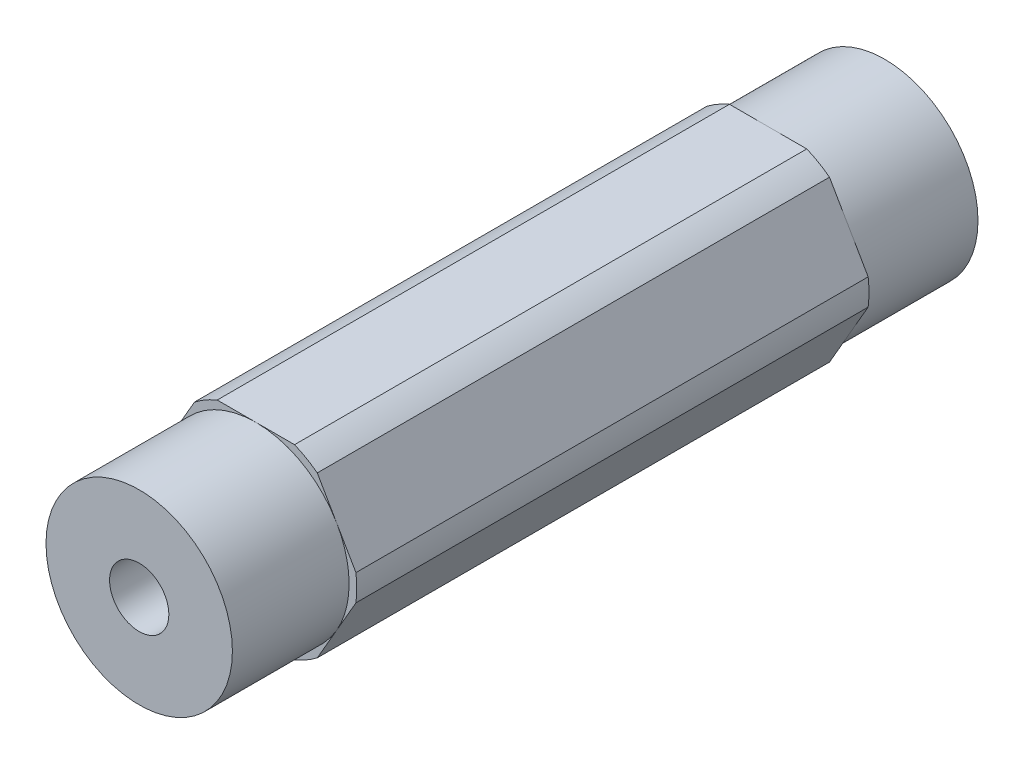
ISO-10303-21;
HEADER;
FILE_DESCRIPTION(('STEP AP214'),'2;1');
FILE_NAME('part.step','',(''),(''),'','','');
FILE_SCHEMA(('AUTOMOTIVE_DESIGN { 1 0 10303 214 1 1 1 1 }'));
ENDSEC;
DATA;
#1=APPLICATION_CONTEXT('core data for automotive mechanical design processes');
#2=APPLICATION_PROTOCOL_DEFINITION('international standard','automotive_design',2000,#1);
#3=PRODUCT_CONTEXT('',#1,'mechanical');
#4=PRODUCT('Part','Part','',(#3));
#5=PRODUCT_RELATED_PRODUCT_CATEGORY('part','',(#4));
#6=PRODUCT_DEFINITION_FORMATION('','',#4);
#7=PRODUCT_DEFINITION_CONTEXT('part definition',#1,'design');
#8=PRODUCT_DEFINITION('design','',#6,#7);
#9=PRODUCT_DEFINITION_SHAPE('','',#8);
#10=(LENGTH_UNIT() NAMED_UNIT(*) SI_UNIT(.MILLI.,.METRE.));
#11=(NAMED_UNIT(*) PLANE_ANGLE_UNIT() SI_UNIT($,.RADIAN.));
#12=(NAMED_UNIT(*) SI_UNIT($,.STERADIAN.) SOLID_ANGLE_UNIT());
#13=UNCERTAINTY_MEASURE_WITH_UNIT(LENGTH_MEASURE(1.E-05),#10,'distance_accuracy_value','');
#14=(GEOMETRIC_REPRESENTATION_CONTEXT(3) GLOBAL_UNCERTAINTY_ASSIGNED_CONTEXT((#13)) GLOBAL_UNIT_ASSIGNED_CONTEXT((#10,
#11,#12)) REPRESENTATION_CONTEXT('',''));
#15=CARTESIAN_POINT('',(0.,0.,0.));
#16=DIRECTION('',(0.,0.,1.));
#17=DIRECTION('',(1.,0.,0.));
#18=AXIS2_PLACEMENT_3D('',#15,#16,#17);
#19=CARTESIAN_POINT('',(3.66617420935409,6.34999999999998,25.4));
#20=DIRECTION('',(0.,-1.,0.));
#21=DIRECTION('',(1.,0.,0.));
#22=AXIS2_PLACEMENT_3D('',#19,#20,#21);
#23=PLANE('',#22);
#24=DIRECTION('',(1.,0.,0.));
#25=VECTOR('',#24,1.);
#26=CARTESIAN_POINT('',(3.66617420935409,6.34999999999998,-17.4498));
#27=LINE('',#26,#25);
#28=CARTESIAN_POINT('',(-2.63498102459971,6.34999999999996,-17.4498));
#29=VERTEX_POINT('',#28);
#30=CARTESIAN_POINT('',(0.,6.34999999999997,-17.4498));
#31=VERTEX_POINT('',#30);
#32=EDGE_CURVE('E216',#29,#31,#27,.T.);
#33=ORIENTED_EDGE('',*,*,#32,.F.);
#34=DIRECTION('',(0.,0.,1.));
#35=VECTOR('',#34,1.);
#36=CARTESIAN_POINT('',(-2.63498102459971,6.34999999999996,-25.4));
#37=LINE('',#36,#35);
#38=CARTESIAN_POINT('',(-2.63498102459971,6.34999999999996,17.4498));
#39=VERTEX_POINT('',#38);
#40=EDGE_CURVE('E294',#39,#29,#37,.F.);
#41=ORIENTED_EDGE('',*,*,#40,.F.);
#42=DIRECTION('',(-1.,0.,0.));
#43=VECTOR('',#42,1.);
#44=CARTESIAN_POINT('',(3.66617420935409,6.34999999999998,17.4498));
#45=LINE('',#44,#43);
#46=CARTESIAN_POINT('',(0.,6.34999999999997,17.4498));
#47=VERTEX_POINT('',#46);
#48=EDGE_CURVE('E332',#47,#39,#45,.T.);
#49=ORIENTED_EDGE('',*,*,#48,.F.);
#50=CARTESIAN_POINT('',(2.63498102459967,6.34999999999997,17.4498));
#51=VERTEX_POINT('',#50);
#52=EDGE_CURVE('E336',#51,#47,#45,.T.);
#53=ORIENTED_EDGE('',*,*,#52,.F.);
#54=DIRECTION('',(0.,0.,1.));
#55=VECTOR('',#54,1.);
#56=CARTESIAN_POINT('',(2.63498102459967,6.34999999999997,-25.4));
#57=LINE('',#56,#55);
#58=CARTESIAN_POINT('',(2.63498102459967,6.34999999999997,-17.4498));
#59=VERTEX_POINT('',#58);
#60=EDGE_CURVE('E69',#59,#51,#57,.T.);
#61=ORIENTED_EDGE('',*,*,#60,.F.);
#62=EDGE_CURVE('E63',#31,#59,#27,.T.);
#63=ORIENTED_EDGE('',*,*,#62,.F.);
#64=EDGE_LOOP('',(#33,#41,#49,#53,#61,#63));
#65=FACE_BOUND('',#64,.T.);
#66=ADVANCED_FACE('F48',(#65),#23,.F.);
#67=CARTESIAN_POINT('',(-3.66617420935414,6.34999999999995,25.4));
#68=DIRECTION('',(0.866025403784442,-0.499999999999995,0.));
#69=DIRECTION('',(0.499999999999995,0.866025403784442,0.));
#70=AXIS2_PLACEMENT_3D('',#67,#68,#69);
#71=PLANE('',#70);
#72=DIRECTION('',(0.499999999999995,0.866025403784442,0.));
#73=VECTOR('',#72,1.);
#74=CARTESIAN_POINT('',(-3.66617420935414,6.34999999999995,-17.4498));
#75=LINE('',#74,#73);
#76=CARTESIAN_POINT('',(-6.81675182633101,0.893039494206661,-17.4498));
#77=VERTEX_POINT('',#76);
#78=CARTESIAN_POINT('',(-5.49926131403117,3.17499999999995,-17.4498));
#79=VERTEX_POINT('',#78);
#80=EDGE_CURVE('E213',#77,#79,#75,.T.);
#81=ORIENTED_EDGE('',*,*,#80,.F.);
#82=DIRECTION('',(0.,0.,1.));
#83=VECTOR('',#82,1.);
#84=CARTESIAN_POINT('',(-6.81675182633101,0.89303949420666,-25.4));
#85=LINE('',#84,#83);
#86=CARTESIAN_POINT('',(-6.81675182633101,0.89303949420666,17.4498));
#87=VERTEX_POINT('',#86);
#88=EDGE_CURVE('E283',#87,#77,#85,.F.);
#89=ORIENTED_EDGE('',*,*,#88,.F.);
#90=DIRECTION('',(-0.499999999999995,-0.866025403784442,0.));
#91=VECTOR('',#90,1.);
#92=CARTESIAN_POINT('',(-3.66617420935414,6.34999999999995,17.4498));
#93=LINE('',#92,#91);
#94=CARTESIAN_POINT('',(-5.49926131403117,3.17499999999995,17.4498));
#95=VERTEX_POINT('',#94);
#96=EDGE_CURVE('E327',#95,#87,#93,.T.);
#97=ORIENTED_EDGE('',*,*,#96,.F.);
#98=CARTESIAN_POINT('',(-4.18177080173134,5.45696050579324,17.4498));
#99=VERTEX_POINT('',#98);
#100=EDGE_CURVE('E331',#99,#95,#93,.T.);
#101=ORIENTED_EDGE('',*,*,#100,.F.);
#102=DIRECTION('',(0.,0.,1.));
#103=VECTOR('',#102,1.);
#104=CARTESIAN_POINT('',(-4.18177080173134,5.45696050579324,-25.4));
#105=LINE('',#104,#103);
#106=CARTESIAN_POINT('',(-4.18177080173134,5.45696050579324,-17.4498));
#107=VERTEX_POINT('',#106);
#108=EDGE_CURVE('E291',#107,#99,#105,.T.);
#109=ORIENTED_EDGE('',*,*,#108,.F.);
#110=EDGE_CURVE('E209',#79,#107,#75,.T.);
#111=ORIENTED_EDGE('',*,*,#110,.F.);
#112=EDGE_LOOP('',(#81,#89,#97,#101,#109,#111));
#113=FACE_BOUND('',#112,.T.);
#114=ADVANCED_FACE('F405',(#113),#71,.F.);
#115=CARTESIAN_POINT('',(-7.33234841870821,0.,25.4));
#116=DIRECTION('',(0.866025403784435,0.500000000000007,0.));
#117=DIRECTION('',(-0.500000000000007,0.866025403784435,0.));
#118=AXIS2_PLACEMENT_3D('',#115,#116,#117);
#119=PLANE('',#118);
#120=DIRECTION('',(-0.500000000000007,0.866025403784435,0.));
#121=VECTOR('',#120,1.);
#122=CARTESIAN_POINT('',(-7.33234841870821,0.,-17.4498));
#123=LINE('',#122,#121);
#124=CARTESIAN_POINT('',(-4.18177080173127,-5.4569605057933,-17.4498));
#125=VERTEX_POINT('',#124);
#126=CARTESIAN_POINT('',(-5.49926131403113,-3.17500000000003,-17.4498));
#127=VERTEX_POINT('',#126);
#128=EDGE_CURVE('E235',#125,#127,#123,.T.);
#129=ORIENTED_EDGE('',*,*,#128,.F.);
#130=DIRECTION('',(0.,0.,1.));
#131=VECTOR('',#130,1.);
#132=CARTESIAN_POINT('',(-4.18177080173127,-5.4569605057933,-25.4));
#133=LINE('',#132,#131);
#134=CARTESIAN_POINT('',(-4.18177080173127,-5.4569605057933,17.4498));
#135=VERTEX_POINT('',#134);
#136=EDGE_CURVE('E272',#135,#125,#133,.F.);
#137=ORIENTED_EDGE('',*,*,#136,.F.);
#138=DIRECTION('',(0.500000000000007,-0.866025403784435,0.));
#139=VECTOR('',#138,1.);
#140=CARTESIAN_POINT('',(-7.33234841870821,0.,17.4498));
#141=LINE('',#140,#139);
#142=CARTESIAN_POINT('',(-5.49926131403113,-3.17500000000003,17.4498));
#143=VERTEX_POINT('',#142);
#144=EDGE_CURVE('E322',#143,#135,#141,.T.);
#145=ORIENTED_EDGE('',*,*,#144,.F.);
#146=CARTESIAN_POINT('',(-6.81675182633099,-0.893039494206758,17.4498));
#147=VERTEX_POINT('',#146);
#148=EDGE_CURVE('E326',#147,#143,#141,.T.);
#149=ORIENTED_EDGE('',*,*,#148,.F.);
#150=DIRECTION('',(0.,0.,1.));
#151=VECTOR('',#150,1.);
#152=CARTESIAN_POINT('',(-6.81675182633099,-0.893039494206758,-25.4));
#153=LINE('',#152,#151);
#154=CARTESIAN_POINT('',(-6.81675182633099,-0.893039494206757,-17.4498));
#155=VERTEX_POINT('',#154);
#156=EDGE_CURVE('E280',#155,#147,#153,.T.);
#157=ORIENTED_EDGE('',*,*,#156,.F.);
#158=EDGE_CURVE('E231',#127,#155,#123,.T.);
#159=ORIENTED_EDGE('',*,*,#158,.F.);
#160=EDGE_LOOP('',(#129,#137,#145,#149,#157,#159));
#161=FACE_BOUND('',#160,.T.);
#162=ADVANCED_FACE('F457',(#161),#119,.F.);
#163=CARTESIAN_POINT('',(-3.66617420935405,-6.35,25.4));
#164=DIRECTION('',(0.,1.,0.));
#165=DIRECTION('',(-1.,0.,0.));
#166=AXIS2_PLACEMENT_3D('',#163,#164,#165);
#167=PLANE('',#166);
#168=DIRECTION('',(-1.,0.,0.));
#169=VECTOR('',#168,1.);
#170=CARTESIAN_POINT('',(-3.66617420935405,-6.35,-17.4498));
#171=LINE('',#170,#169);
#172=CARTESIAN_POINT('',(2.63498102459976,-6.34999999999994,-17.4498));
#173=VERTEX_POINT('',#172);
#174=CARTESIAN_POINT('',(0.,-6.34999999999997,-17.4498));
#175=VERTEX_POINT('',#174);
#176=EDGE_CURVE('E243',#173,#175,#171,.T.);
#177=ORIENTED_EDGE('',*,*,#176,.F.);
#178=DIRECTION('',(0.,0.,1.));
#179=VECTOR('',#178,1.);
#180=CARTESIAN_POINT('',(2.63498102459976,-6.34999999999994,-25.4));
#181=LINE('',#180,#179);
#182=CARTESIAN_POINT('',(2.63498102459976,-6.34999999999994,17.4498));
#183=VERTEX_POINT('',#182);
#184=EDGE_CURVE('E261',#183,#173,#181,.F.);
#185=ORIENTED_EDGE('',*,*,#184,.F.);
#186=DIRECTION('',(1.,0.,0.));
#187=VECTOR('',#186,1.);
#188=CARTESIAN_POINT('',(-3.66617420935405,-6.35,17.4498));
#189=LINE('',#188,#187);
#190=CARTESIAN_POINT('',(0.,-6.34999999999997,17.4498));
#191=VERTEX_POINT('',#190);
#192=EDGE_CURVE('E317',#191,#183,#189,.T.);
#193=ORIENTED_EDGE('',*,*,#192,.F.);
#194=CARTESIAN_POINT('',(-2.63498102459963,-6.34999999999999,17.4498));
#195=VERTEX_POINT('',#194);
#196=EDGE_CURVE('E321',#195,#191,#189,.T.);
#197=ORIENTED_EDGE('',*,*,#196,.F.);
#198=DIRECTION('',(0.,0.,1.));
#199=VECTOR('',#198,1.);
#200=CARTESIAN_POINT('',(-2.63498102459963,-6.34999999999999,-25.4));
#201=LINE('',#200,#199);
#202=CARTESIAN_POINT('',(-2.63498102459963,-6.34999999999999,-17.4498));
#203=VERTEX_POINT('',#202);
#204=EDGE_CURVE('E269',#203,#195,#201,.T.);
#205=ORIENTED_EDGE('',*,*,#204,.F.);
#206=EDGE_CURVE('E240',#175,#203,#171,.T.);
#207=ORIENTED_EDGE('',*,*,#206,.F.);
#208=EDGE_LOOP('',(#177,#185,#193,#197,#205,#207));
#209=FACE_BOUND('',#208,.T.);
#210=ADVANCED_FACE('F427',(#209),#167,.F.);
#211=CARTESIAN_POINT('',(3.66617420935418,-6.34999999999993,25.4));
#212=DIRECTION('',(-0.866025403784441,0.499999999999995,0.));
#213=DIRECTION('',(-0.499999999999995,-0.866025403784441,0.));
#214=AXIS2_PLACEMENT_3D('',#211,#212,#213);
#215=PLANE('',#214);
#216=DIRECTION('',(-0.499999999999995,-0.866025403784441,0.));
#217=VECTOR('',#216,1.);
#218=CARTESIAN_POINT('',(3.66617420935418,-6.34999999999993,-17.4498));
#219=LINE('',#218,#217);
#220=CARTESIAN_POINT('',(6.816751826331,-0.893039494206728,-17.4498));
#221=VERTEX_POINT('',#220);
#222=CARTESIAN_POINT('',(5.49926131403117,-3.17499999999995,-17.4498));
#223=VERTEX_POINT('',#222);
#224=EDGE_CURVE('E189',#221,#223,#219,.T.);
#225=ORIENTED_EDGE('',*,*,#224,.F.);
#226=DIRECTION('',(0.,0.,1.));
#227=VECTOR('',#226,1.);
#228=CARTESIAN_POINT('',(6.816751826331,-0.893039494206728,-25.4));
#229=LINE('',#228,#227);
#230=CARTESIAN_POINT('',(6.816751826331,-0.893039494206728,17.4498));
#231=VERTEX_POINT('',#230);
#232=EDGE_CURVE('E250',#231,#221,#229,.F.);
#233=ORIENTED_EDGE('',*,*,#232,.F.);
#234=DIRECTION('',(0.499999999999995,0.866025403784441,0.));
#235=VECTOR('',#234,1.);
#236=CARTESIAN_POINT('',(3.66617420935418,-6.34999999999993,17.4498));
#237=LINE('',#236,#235);
#238=CARTESIAN_POINT('',(5.49926131403117,-3.17499999999995,17.4498));
#239=VERTEX_POINT('',#238);
#240=EDGE_CURVE('E311',#239,#231,#237,.T.);
#241=ORIENTED_EDGE('',*,*,#240,.F.);
#242=CARTESIAN_POINT('',(4.18177080173139,-5.4569605057932,17.4498));
#243=VERTEX_POINT('',#242);
#244=EDGE_CURVE('E316',#243,#239,#237,.T.);
#245=ORIENTED_EDGE('',*,*,#244,.F.);
#246=DIRECTION('',(0.,0.,1.));
#247=VECTOR('',#246,1.);
#248=CARTESIAN_POINT('',(4.18177080173139,-5.4569605057932,-25.4));
#249=LINE('',#248,#247);
#250=CARTESIAN_POINT('',(4.18177080173139,-5.4569605057932,-17.4498));
#251=VERTEX_POINT('',#250);
#252=EDGE_CURVE('E258',#251,#243,#249,.T.);
#253=ORIENTED_EDGE('',*,*,#252,.F.);
#254=EDGE_CURVE('E232',#223,#251,#219,.T.);
#255=ORIENTED_EDGE('',*,*,#254,.F.);
#256=EDGE_LOOP('',(#225,#233,#241,#245,#253,#255));
#257=FACE_BOUND('',#256,.T.);
#258=ADVANCED_FACE('F434',(#257),#215,.F.);
#259=CARTESIAN_POINT('',(7.33234841870821,0.,25.4));
#260=DIRECTION('',(-0.866025403784438,-0.500000000000001,0.));
#261=DIRECTION('',(0.500000000000001,-0.866025403784438,0.));
#262=AXIS2_PLACEMENT_3D('',#259,#260,#261);
#263=PLANE('',#262);
#264=DIRECTION('',(0.500000000000001,-0.866025403784438,0.));
#265=VECTOR('',#264,1.);
#266=CARTESIAN_POINT('',(7.33234841870821,0.,-17.4498));
#267=LINE('',#266,#265);
#268=CARTESIAN_POINT('',(4.1817708017313,5.45696050579327,-17.4498));
#269=VERTEX_POINT('',#268);
#270=CARTESIAN_POINT('',(5.49926131403115,3.17499999999999,-17.4498));
#271=VERTEX_POINT('',#270);
#272=EDGE_CURVE('E171',#269,#271,#267,.T.);
#273=ORIENTED_EDGE('',*,*,#272,.F.);
#274=DIRECTION('',(0.,0.,1.));
#275=VECTOR('',#274,1.);
#276=CARTESIAN_POINT('',(4.1817708017313,5.45696050579327,-25.4));
#277=LINE('',#276,#275);
#278=CARTESIAN_POINT('',(4.18177080173131,5.45696050579327,17.4498));
#279=VERTEX_POINT('',#278);
#280=EDGE_CURVE('E301',#279,#269,#277,.F.);
#281=ORIENTED_EDGE('',*,*,#280,.F.);
#282=DIRECTION('',(-0.500000000000001,0.866025403784438,0.));
#283=VECTOR('',#282,1.);
#284=CARTESIAN_POINT('',(7.33234841870821,0.,17.4498));
#285=LINE('',#284,#283);
#286=CARTESIAN_POINT('',(5.49926131403115,3.17499999999999,17.4498));
#287=VERTEX_POINT('',#286);
#288=EDGE_CURVE('E341',#287,#279,#285,.T.);
#289=ORIENTED_EDGE('',*,*,#288,.F.);
#290=CARTESIAN_POINT('',(6.816751826331,0.893039494206714,17.4498));
#291=VERTEX_POINT('',#290);
#292=EDGE_CURVE('E344',#291,#287,#285,.T.);
#293=ORIENTED_EDGE('',*,*,#292,.F.);
#294=DIRECTION('',(0.,0.,1.));
#295=VECTOR('',#294,1.);
#296=CARTESIAN_POINT('',(6.816751826331,0.89303949420671,-25.4));
#297=LINE('',#296,#295);
#298=CARTESIAN_POINT('',(6.816751826331,0.89303949420671,-17.4498));
#299=VERTEX_POINT('',#298);
#300=EDGE_CURVE('E207',#299,#291,#297,.T.);
#301=ORIENTED_EDGE('',*,*,#300,.F.);
#302=EDGE_CURVE('E182',#271,#299,#267,.T.);
#303=ORIENTED_EDGE('',*,*,#302,.F.);
#304=EDGE_LOOP('',(#273,#281,#289,#293,#301,#303));
#305=FACE_BOUND('',#304,.T.);
#306=ADVANCED_FACE('F205',(#305),#263,.F.);
#307=CARTESIAN_POINT('',(0.,0.,-25.4));
#308=DIRECTION('',(0.,0.,1.));
#309=DIRECTION('',(1.,0.,0.));
#310=AXIS2_PLACEMENT_3D('',#307,#308,#309);
#311=CYLINDRICAL_SURFACE('',#310,6.875);
#312=ORIENTED_EDGE('',*,*,#232,.T.);
#313=CARTESIAN_POINT('',(0.,0.,-17.4498));
#314=DIRECTION('',(0.,0.,-1.));
#315=DIRECTION('',(-1.,0.,0.));
#316=AXIS2_PLACEMENT_3D('',#313,#314,#315);
#317=CIRCLE('',#316,6.875);
#318=EDGE_CURVE('E226',#221,#299,#317,.F.);
#319=ORIENTED_EDGE('',*,*,#318,.T.);
#320=ORIENTED_EDGE('',*,*,#300,.T.);
#321=CARTESIAN_POINT('',(0.,0.,17.4498));
#322=DIRECTION('',(0.,0.,1.));
#323=DIRECTION('',(1.,0.,0.));
#324=AXIS2_PLACEMENT_3D('',#321,#322,#323);
#325=CIRCLE('',#324,6.875);
#326=EDGE_CURVE('E56',#231,#291,#325,.T.);
#327=ORIENTED_EDGE('',*,*,#326,.F.);
#328=EDGE_LOOP('',(#312,#319,#320,#327));
#329=FACE_BOUND('',#328,.T.);
#330=ADVANCED_FACE('F438',(#329),#311,.T.);
#331=ORIENTED_EDGE('',*,*,#184,.T.);
#332=CARTESIAN_POINT('',(0.,0.,-17.4498));
#333=DIRECTION('',(0.,0.,-1.));
#334=DIRECTION('',(-1.,0.,0.));
#335=AXIS2_PLACEMENT_3D('',#332,#333,#334);
#336=CIRCLE('',#335,6.875);
#337=EDGE_CURVE('E244',#173,#251,#336,.F.);
#338=ORIENTED_EDGE('',*,*,#337,.T.);
#339=ORIENTED_EDGE('',*,*,#252,.T.);
#340=CARTESIAN_POINT('',(0.,0.,17.4498));
#341=DIRECTION('',(0.,0.,1.));
#342=DIRECTION('',(1.,0.,0.));
#343=AXIS2_PLACEMENT_3D('',#340,#341,#342);
#344=CIRCLE('',#343,6.875);
#345=EDGE_CURVE('E254',#183,#243,#344,.T.);
#346=ORIENTED_EDGE('',*,*,#345,.F.);
#347=EDGE_LOOP('',(#331,#338,#339,#346));
#348=FACE_BOUND('',#347,.T.);
#349=ADVANCED_FACE('F440',(#348),#311,.T.);
#350=ORIENTED_EDGE('',*,*,#136,.T.);
#351=CARTESIAN_POINT('',(0.,0.,-17.4498));
#352=DIRECTION('',(0.,0.,-1.));
#353=DIRECTION('',(-1.,0.,0.));
#354=AXIS2_PLACEMENT_3D('',#351,#352,#353);
#355=CIRCLE('',#354,6.875);
#356=EDGE_CURVE('E236',#125,#203,#355,.F.);
#357=ORIENTED_EDGE('',*,*,#356,.T.);
#358=ORIENTED_EDGE('',*,*,#204,.T.);
#359=CARTESIAN_POINT('',(0.,0.,17.4498));
#360=DIRECTION('',(0.,0.,1.));
#361=DIRECTION('',(1.,0.,0.));
#362=AXIS2_PLACEMENT_3D('',#359,#360,#361);
#363=CIRCLE('',#362,6.875);
#364=EDGE_CURVE('E265',#135,#195,#363,.T.);
#365=ORIENTED_EDGE('',*,*,#364,.F.);
#366=EDGE_LOOP('',(#350,#357,#358,#365));
#367=FACE_BOUND('',#366,.T.);
#368=ADVANCED_FACE('F446',(#367),#311,.T.);
#369=ORIENTED_EDGE('',*,*,#88,.T.);
#370=CARTESIAN_POINT('',(0.,0.,-17.4498));
#371=DIRECTION('',(0.,0.,-1.));
#372=DIRECTION('',(-1.,0.,0.));
#373=AXIS2_PLACEMENT_3D('',#370,#371,#372);
#374=CIRCLE('',#373,6.875);
#375=EDGE_CURVE('E222',#77,#155,#374,.F.);
#376=ORIENTED_EDGE('',*,*,#375,.T.);
#377=ORIENTED_EDGE('',*,*,#156,.T.);
#378=CARTESIAN_POINT('',(0.,0.,17.4498));
#379=DIRECTION('',(0.,0.,1.));
#380=DIRECTION('',(1.,0.,0.));
#381=AXIS2_PLACEMENT_3D('',#378,#379,#380);
#382=CIRCLE('',#381,6.875);
#383=EDGE_CURVE('E276',#87,#147,#382,.T.);
#384=ORIENTED_EDGE('',*,*,#383,.F.);
#385=EDGE_LOOP('',(#369,#376,#377,#384));
#386=FACE_BOUND('',#385,.T.);
#387=ADVANCED_FACE('F518',(#386),#311,.T.);
#388=ORIENTED_EDGE('',*,*,#40,.T.);
#389=CARTESIAN_POINT('',(0.,0.,-17.4498));
#390=DIRECTION('',(0.,0.,-1.));
#391=DIRECTION('',(-1.,0.,0.));
#392=AXIS2_PLACEMENT_3D('',#389,#390,#391);
#393=CIRCLE('',#392,6.875);
#394=EDGE_CURVE('E210',#29,#107,#393,.F.);
#395=ORIENTED_EDGE('',*,*,#394,.T.);
#396=ORIENTED_EDGE('',*,*,#108,.T.);
#397=CARTESIAN_POINT('',(0.,0.,17.4498));
#398=DIRECTION('',(0.,0.,1.));
#399=DIRECTION('',(1.,0.,0.));
#400=AXIS2_PLACEMENT_3D('',#397,#398,#399);
#401=CIRCLE('',#400,6.875);
#402=EDGE_CURVE('E287',#39,#99,#401,.T.);
#403=ORIENTED_EDGE('',*,*,#402,.F.);
#404=EDGE_LOOP('',(#388,#395,#396,#403));
#405=FACE_BOUND('',#404,.T.);
#406=ADVANCED_FACE('F409',(#405),#311,.T.);
#407=ORIENTED_EDGE('',*,*,#280,.T.);
#408=CARTESIAN_POINT('',(0.,0.,-17.4498));
#409=DIRECTION('',(0.,0.,-1.));
#410=DIRECTION('',(-1.,0.,0.));
#411=AXIS2_PLACEMENT_3D('',#408,#409,#410);
#412=CIRCLE('',#411,6.875);
#413=EDGE_CURVE('E12',#269,#59,#412,.F.);
#414=ORIENTED_EDGE('',*,*,#413,.T.);
#415=ORIENTED_EDGE('',*,*,#60,.T.);
#416=CARTESIAN_POINT('',(0.,0.,17.4498));
#417=DIRECTION('',(0.,0.,1.));
#418=DIRECTION('',(1.,0.,0.));
#419=AXIS2_PLACEMENT_3D('',#416,#417,#418);
#420=CIRCLE('',#419,6.875);
#421=EDGE_CURVE('E298',#279,#51,#420,.T.);
#422=ORIENTED_EDGE('',*,*,#421,.F.);
#423=EDGE_LOOP('',(#407,#414,#415,#422));
#424=FACE_BOUND('',#423,.T.);
#425=ADVANCED_FACE('F368',(#424),#311,.T.);
#426=CARTESIAN_POINT('',(0.,0.,17.4498));
#427=DIRECTION('',(0.,0.,1.));
#428=DIRECTION('',(1.,0.,0.));
#429=AXIS2_PLACEMENT_3D('',#426,#427,#428);
#430=PLANE('',#429);
#431=ORIENTED_EDGE('',*,*,#288,.T.);
#432=ORIENTED_EDGE('',*,*,#421,.T.);
#433=ORIENTED_EDGE('',*,*,#52,.T.);
#434=CARTESIAN_POINT('',(0.,0.,17.4498));
#435=DIRECTION('',(0.,0.,1.));
#436=DIRECTION('',(1.,0.,0.));
#437=AXIS2_PLACEMENT_3D('',#434,#435,#436);
#438=CIRCLE('',#437,6.34999999999997);
#439=EDGE_CURVE('E307',#287,#47,#438,.T.);
#440=ORIENTED_EDGE('',*,*,#439,.F.);
#441=EDGE_LOOP('',(#431,#432,#433,#440));
#442=FACE_BOUND('',#441,.T.);
#443=ADVANCED_FACE('F356',(#442),#430,.T.);
#444=ORIENTED_EDGE('',*,*,#48,.T.);
#445=ORIENTED_EDGE('',*,*,#402,.T.);
#446=ORIENTED_EDGE('',*,*,#100,.T.);
#447=EDGE_CURVE('E312',#47,#95,#438,.T.);
#448=ORIENTED_EDGE('',*,*,#447,.F.);
#449=EDGE_LOOP('',(#444,#445,#446,#448));
#450=FACE_BOUND('',#449,.T.);
#451=ADVANCED_FACE('F411',(#450),#430,.T.);
#452=ORIENTED_EDGE('',*,*,#96,.T.);
#453=ORIENTED_EDGE('',*,*,#383,.T.);
#454=ORIENTED_EDGE('',*,*,#148,.T.);
#455=EDGE_CURVE('E379',#95,#143,#438,.T.);
#456=ORIENTED_EDGE('',*,*,#455,.F.);
#457=EDGE_LOOP('',(#452,#453,#454,#456));
#458=FACE_BOUND('',#457,.T.);
#459=ADVANCED_FACE('F415',(#458),#430,.T.);
#460=ORIENTED_EDGE('',*,*,#144,.T.);
#461=ORIENTED_EDGE('',*,*,#364,.T.);
#462=ORIENTED_EDGE('',*,*,#196,.T.);
#463=EDGE_CURVE('E382',#143,#191,#438,.T.);
#464=ORIENTED_EDGE('',*,*,#463,.F.);
#465=EDGE_LOOP('',(#460,#461,#462,#464));
#466=FACE_BOUND('',#465,.T.);
#467=ADVANCED_FACE('F421',(#466),#430,.T.);
#468=ORIENTED_EDGE('',*,*,#192,.T.);
#469=ORIENTED_EDGE('',*,*,#345,.T.);
#470=ORIENTED_EDGE('',*,*,#244,.T.);
#471=EDGE_CURVE('E365',#191,#239,#438,.T.);
#472=ORIENTED_EDGE('',*,*,#471,.F.);
#473=EDGE_LOOP('',(#468,#469,#470,#472));
#474=FACE_BOUND('',#473,.T.);
#475=ADVANCED_FACE('F430',(#474),#430,.T.);
#476=ORIENTED_EDGE('',*,*,#240,.T.);
#477=ORIENTED_EDGE('',*,*,#326,.T.);
#478=ORIENTED_EDGE('',*,*,#292,.T.);
#479=EDGE_CURVE('E306',#239,#287,#438,.T.);
#480=ORIENTED_EDGE('',*,*,#479,.F.);
#481=EDGE_LOOP('',(#476,#477,#478,#480));
#482=FACE_BOUND('',#481,.T.);
#483=ADVANCED_FACE('F351',(#482),#430,.T.);
#484=CARTESIAN_POINT('',(0.,0.,17.4498));
#485=DIRECTION('',(0.,0.,1.));
#486=DIRECTION('',(1.,0.,0.));
#487=AXIS2_PLACEMENT_3D('',#484,#485,#486);
#488=CYLINDRICAL_SURFACE('',#487,6.34999999999997);
#489=CARTESIAN_POINT('',(0.,0.,25.4));
#490=DIRECTION('',(0.,0.,1.));
#491=DIRECTION('',(1.,0.,0.));
#492=AXIS2_PLACEMENT_3D('',#489,#490,#491);
#493=CIRCLE('',#492,6.34999999999997);
#494=CARTESIAN_POINT('',(6.34999999999997,0.,25.4));
#495=VERTEX_POINT('',#494);
#496=EDGE_CURVE('E337',#495,#495,#493,.T.);
#497=ORIENTED_EDGE('',*,*,#496,.F.);
#498=EDGE_LOOP('',(#497));
#499=FACE_BOUND('',#498,.T.);
#500=ORIENTED_EDGE('',*,*,#439,.T.);
#501=ORIENTED_EDGE('',*,*,#447,.T.);
#502=ORIENTED_EDGE('',*,*,#455,.T.);
#503=ORIENTED_EDGE('',*,*,#463,.T.);
#504=ORIENTED_EDGE('',*,*,#471,.T.);
#505=ORIENTED_EDGE('',*,*,#479,.T.);
#506=EDGE_LOOP('',(#500,#501,#502,#503,#504,#505));
#507=FACE_BOUND('',#506,.T.);
#508=ADVANCED_FACE('F362',(#499,#507),#488,.T.);
#509=CARTESIAN_POINT('',(0.,0.,25.4));
#510=DIRECTION('',(0.,0.,1.));
#511=DIRECTION('',(1.,0.,0.));
#512=AXIS2_PLACEMENT_3D('',#509,#510,#511);
#513=PLANE('',#512);
#514=CARTESIAN_POINT('',(0.,0.,25.4));
#515=DIRECTION('',(0.,0.,1.));
#516=DIRECTION('',(1.,0.,0.));
#517=AXIS2_PLACEMENT_3D('',#514,#515,#516);
#518=CIRCLE('',#517,2.0193);
#519=CARTESIAN_POINT('',(2.0193,0.,25.4));
#520=VERTEX_POINT('',#519);
#521=EDGE_CURVE('E676',#520,#520,#518,.T.);
#522=ORIENTED_EDGE('',*,*,#521,.F.);
#523=EDGE_LOOP('',(#522));
#524=FACE_BOUND('',#523,.T.);
#525=ORIENTED_EDGE('',*,*,#496,.T.);
#526=EDGE_LOOP('',(#525));
#527=FACE_BOUND('',#526,.T.);
#528=ADVANCED_FACE('F473',(#524,#527),#513,.T.);
#529=CARTESIAN_POINT('',(0.,0.,-17.4498));
#530=DIRECTION('',(0.,0.,-1.));
#531=DIRECTION('',(-1.,0.,0.));
#532=AXIS2_PLACEMENT_3D('',#529,#530,#531);
#533=CYLINDRICAL_SURFACE('',#532,6.34999999999997);
#534=CARTESIAN_POINT('',(0.,0.,-17.4498));
#535=DIRECTION('',(0.,0.,1.));
#536=DIRECTION('',(1.,0.,0.));
#537=AXIS2_PLACEMENT_3D('',#534,#535,#536);
#538=CIRCLE('',#537,6.34999999999997);
#539=EDGE_CURVE('E202',#31,#79,#538,.T.);
#540=ORIENTED_EDGE('',*,*,#539,.F.);
#541=EDGE_CURVE('E175',#271,#31,#538,.T.);
#542=ORIENTED_EDGE('',*,*,#541,.F.);
#543=EDGE_CURVE('E185',#223,#271,#538,.T.);
#544=ORIENTED_EDGE('',*,*,#543,.F.);
#545=EDGE_CURVE('E194',#175,#223,#538,.T.);
#546=ORIENTED_EDGE('',*,*,#545,.F.);
#547=EDGE_CURVE('E399',#127,#175,#538,.T.);
#548=ORIENTED_EDGE('',*,*,#547,.F.);
#549=EDGE_CURVE('E392',#79,#127,#538,.T.);
#550=ORIENTED_EDGE('',*,*,#549,.F.);
#551=EDGE_LOOP('',(#540,#542,#544,#546,#548,#550));
#552=FACE_BOUND('',#551,.T.);
#553=CARTESIAN_POINT('',(0.,0.,-25.4));
#554=DIRECTION('',(0.,0.,1.));
#555=DIRECTION('',(1.,0.,0.));
#556=AXIS2_PLACEMENT_3D('',#553,#554,#555);
#557=CIRCLE('',#556,6.34999999999997);
#558=CARTESIAN_POINT('',(6.34999999999997,0.,-25.4));
#559=VERTEX_POINT('',#558);
#560=EDGE_CURVE('E195',#559,#559,#557,.T.);
#561=ORIENTED_EDGE('',*,*,#560,.T.);
#562=EDGE_LOOP('',(#561));
#563=FACE_BOUND('',#562,.T.);
#564=ADVANCED_FACE('F198',(#552,#563),#533,.T.);
#565=CARTESIAN_POINT('',(0.,0.,-17.4498));
#566=DIRECTION('',(0.,0.,-1.));
#567=DIRECTION('',(-1.,0.,0.));
#568=AXIS2_PLACEMENT_3D('',#565,#566,#567);
#569=PLANE('',#568);
#570=ORIENTED_EDGE('',*,*,#206,.T.);
#571=ORIENTED_EDGE('',*,*,#356,.F.);
#572=ORIENTED_EDGE('',*,*,#128,.T.);
#573=ORIENTED_EDGE('',*,*,#547,.T.);
#574=EDGE_LOOP('',(#570,#571,#572,#573));
#575=FACE_BOUND('',#574,.T.);
#576=ADVANCED_FACE('F584',(#575),#569,.T.);
#577=ORIENTED_EDGE('',*,*,#158,.T.);
#578=ORIENTED_EDGE('',*,*,#375,.F.);
#579=ORIENTED_EDGE('',*,*,#80,.T.);
#580=ORIENTED_EDGE('',*,*,#549,.T.);
#581=EDGE_LOOP('',(#577,#578,#579,#580));
#582=FACE_BOUND('',#581,.T.);
#583=ADVANCED_FACE('F391',(#582),#569,.T.);
#584=ORIENTED_EDGE('',*,*,#224,.T.);
#585=ORIENTED_EDGE('',*,*,#543,.T.);
#586=ORIENTED_EDGE('',*,*,#302,.T.);
#587=ORIENTED_EDGE('',*,*,#318,.F.);
#588=EDGE_LOOP('',(#584,#585,#586,#587));
#589=FACE_BOUND('',#588,.T.);
#590=ADVANCED_FACE('F186',(#589),#569,.T.);
#591=ORIENTED_EDGE('',*,*,#110,.T.);
#592=ORIENTED_EDGE('',*,*,#394,.F.);
#593=ORIENTED_EDGE('',*,*,#32,.T.);
#594=ORIENTED_EDGE('',*,*,#539,.T.);
#595=EDGE_LOOP('',(#591,#592,#593,#594));
#596=FACE_BOUND('',#595,.T.);
#597=ADVANCED_FACE('F402',(#596),#569,.T.);
#598=ORIENTED_EDGE('',*,*,#62,.T.);
#599=ORIENTED_EDGE('',*,*,#413,.F.);
#600=ORIENTED_EDGE('',*,*,#272,.T.);
#601=ORIENTED_EDGE('',*,*,#541,.T.);
#602=EDGE_LOOP('',(#598,#599,#600,#601));
#603=FACE_BOUND('',#602,.T.);
#604=ADVANCED_FACE('F173',(#603),#569,.T.);
#605=ORIENTED_EDGE('',*,*,#176,.T.);
#606=ORIENTED_EDGE('',*,*,#545,.T.);
#607=ORIENTED_EDGE('',*,*,#254,.T.);
#608=ORIENTED_EDGE('',*,*,#337,.F.);
#609=EDGE_LOOP('',(#605,#606,#607,#608));
#610=FACE_BOUND('',#609,.T.);
#611=ADVANCED_FACE('F471',(#610),#569,.T.);
#612=CARTESIAN_POINT('',(0.,0.,-25.4));
#613=DIRECTION('',(0.,0.,1.));
#614=DIRECTION('',(1.,0.,0.));
#615=AXIS2_PLACEMENT_3D('',#612,#613,#614);
#616=PLANE('',#615);
#617=CARTESIAN_POINT('',(0.,0.,-25.4));
#618=DIRECTION('',(0.,0.,1.));
#619=DIRECTION('',(1.,0.,0.));
#620=AXIS2_PLACEMENT_3D('',#617,#618,#619);
#621=CIRCLE('',#620,2.0193);
#622=CARTESIAN_POINT('',(2.0193,0.,-25.4));
#623=VERTEX_POINT('',#622);
#624=EDGE_CURVE('E673',#623,#623,#621,.T.);
#625=ORIENTED_EDGE('',*,*,#624,.T.);
#626=EDGE_LOOP('',(#625));
#627=FACE_BOUND('',#626,.T.);
#628=ORIENTED_EDGE('',*,*,#560,.F.);
#629=EDGE_LOOP('',(#628));
#630=FACE_BOUND('',#629,.T.);
#631=ADVANCED_FACE('F467',(#627,#630),#616,.F.);
#632=CARTESIAN_POINT('',(0.,0.,-25.4));
#633=DIRECTION('',(0.,0.,1.));
#634=DIRECTION('',(1.,0.,0.));
#635=AXIS2_PLACEMENT_3D('',#632,#633,#634);
#636=CYLINDRICAL_SURFACE('',#635,2.0193);
#637=ORIENTED_EDGE('',*,*,#624,.F.);
#638=EDGE_LOOP('',(#637));
#639=FACE_BOUND('',#638,.T.);
#640=ORIENTED_EDGE('',*,*,#521,.T.);
#641=EDGE_LOOP('',(#640));
#642=FACE_BOUND('',#641,.T.);
#643=ADVANCED_FACE('F470',(#639,#642),#636,.F.);
#644=CLOSED_SHELL('',(#66,#114,#162,#210,#258,#306,#330,#349,#368,#387,#406,#425,#443,#451,#459,
#467,#475,#483,#508,#528,#564,#576,#583,#590,#597,#604,#611,#631,#643));
#645=MANIFOLD_SOLID_BREP('B2',#644);
#646=ADVANCED_BREP_SHAPE_REPRESENTATION('',(#18,#645),#14);
#647=SHAPE_DEFINITION_REPRESENTATION(#9,#646);
ENDSEC;
END-ISO-10303-21;
